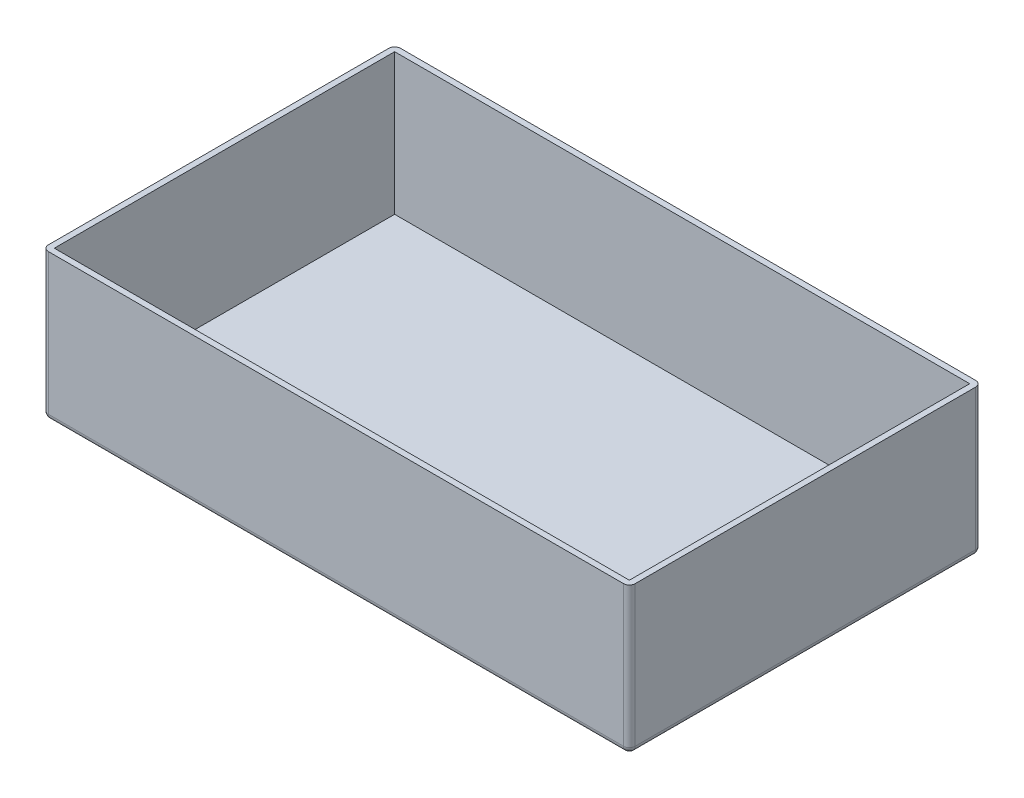
ISO-10303-21;
HEADER;
FILE_DESCRIPTION(('STEP AP214'),'2;1');
FILE_NAME('part.step','',(''),(''),'','','');
FILE_SCHEMA(('AUTOMOTIVE_DESIGN { 1 0 10303 214 1 1 1 1 }'));
ENDSEC;
DATA;
#1=APPLICATION_CONTEXT('core data for automotive mechanical design processes');
#2=APPLICATION_PROTOCOL_DEFINITION('international standard','automotive_design',2000,#1);
#3=PRODUCT_CONTEXT('',#1,'mechanical');
#4=PRODUCT('Part','Part','',(#3));
#5=PRODUCT_RELATED_PRODUCT_CATEGORY('part','',(#4));
#6=PRODUCT_DEFINITION_FORMATION('','',#4);
#7=PRODUCT_DEFINITION_CONTEXT('part definition',#1,'design');
#8=PRODUCT_DEFINITION('design','',#6,#7);
#9=PRODUCT_DEFINITION_SHAPE('','',#8);
#10=(LENGTH_UNIT() NAMED_UNIT(*) SI_UNIT(.MILLI.,.METRE.));
#11=(NAMED_UNIT(*) PLANE_ANGLE_UNIT() SI_UNIT($,.RADIAN.));
#12=(NAMED_UNIT(*) SI_UNIT($,.STERADIAN.) SOLID_ANGLE_UNIT());
#13=UNCERTAINTY_MEASURE_WITH_UNIT(LENGTH_MEASURE(1.E-05),#10,'distance_accuracy_value','');
#14=(GEOMETRIC_REPRESENTATION_CONTEXT(3) GLOBAL_UNCERTAINTY_ASSIGNED_CONTEXT((#13)) GLOBAL_UNIT_ASSIGNED_CONTEXT((#10,
#11,#12)) REPRESENTATION_CONTEXT('',''));
#15=CARTESIAN_POINT('',(0.,0.,0.));
#16=DIRECTION('',(0.,0.,1.));
#17=DIRECTION('',(1.,0.,0.));
#18=AXIS2_PLACEMENT_3D('',#15,#16,#17);
#19=CARTESIAN_POINT('',(100.,50.,-60.));
#20=DIRECTION('',(-1.,0.,0.));
#21=DIRECTION('',(0.,0.,1.));
#22=AXIS2_PLACEMENT_3D('',#19,#20,#21);
#23=PLANE('',#22);
#24=DIRECTION('',(0.,0.,-1.));
#25=VECTOR('',#24,1.);
#26=CARTESIAN_POINT('',(100.,50.,-60.));
#27=LINE('',#26,#25);
#28=CARTESIAN_POINT('',(100.,50.,58.));
#29=VERTEX_POINT('',#28);
#30=CARTESIAN_POINT('',(100.,50.,-58.));
#31=VERTEX_POINT('',#30);
#32=EDGE_CURVE('E188',#29,#31,#27,.T.);
#33=ORIENTED_EDGE('',*,*,#32,.F.);
#34=DIRECTION('',(0.,-1.,0.));
#35=VECTOR('',#34,1.);
#36=CARTESIAN_POINT('',(100.,50.,58.));
#37=LINE('',#36,#35);
#38=CARTESIAN_POINT('',(100.,2.,58.));
#39=VERTEX_POINT('',#38);
#40=EDGE_CURVE('E57',#29,#39,#37,.T.);
#41=ORIENTED_EDGE('',*,*,#40,.T.);
#42=DIRECTION('',(0.,0.,-1.));
#43=VECTOR('',#42,1.);
#44=CARTESIAN_POINT('',(100.,2.,-60.));
#45=LINE('',#44,#43);
#46=CARTESIAN_POINT('',(100.,2.,-58.));
#47=VERTEX_POINT('',#46);
#48=EDGE_CURVE('E62',#39,#47,#45,.T.);
#49=ORIENTED_EDGE('',*,*,#48,.T.);
#50=DIRECTION('',(0.,-1.,0.));
#51=VECTOR('',#50,1.);
#52=CARTESIAN_POINT('',(100.,50.,-58.));
#53=LINE('',#52,#51);
#54=EDGE_CURVE('E245',#47,#31,#53,.F.);
#55=ORIENTED_EDGE('',*,*,#54,.T.);
#56=EDGE_LOOP('',(#33,#41,#49,#55));
#57=FACE_BOUND('',#56,.T.);
#58=ADVANCED_FACE('F39',(#57),#23,.F.);
#59=CARTESIAN_POINT('',(-100.,50.,-60.));
#60=DIRECTION('',(0.,0.,1.));
#61=DIRECTION('',(1.,0.,0.));
#62=AXIS2_PLACEMENT_3D('',#59,#60,#61);
#63=PLANE('',#62);
#64=DIRECTION('',(-1.,0.,0.));
#65=VECTOR('',#64,1.);
#66=CARTESIAN_POINT('',(-100.,2.,-60.));
#67=LINE('',#66,#65);
#68=CARTESIAN_POINT('',(98.,2.,-60.));
#69=VERTEX_POINT('',#68);
#70=CARTESIAN_POINT('',(-98.,2.,-60.));
#71=VERTEX_POINT('',#70);
#72=EDGE_CURVE('E207',#69,#71,#67,.T.);
#73=ORIENTED_EDGE('',*,*,#72,.T.);
#74=DIRECTION('',(0.,-1.,0.));
#75=VECTOR('',#74,1.);
#76=CARTESIAN_POINT('',(-98.,50.,-60.));
#77=LINE('',#76,#75);
#78=CARTESIAN_POINT('',(-98.,50.,-60.));
#79=VERTEX_POINT('',#78);
#80=EDGE_CURVE('E211',#71,#79,#77,.F.);
#81=ORIENTED_EDGE('',*,*,#80,.T.);
#82=DIRECTION('',(-1.,0.,0.));
#83=VECTOR('',#82,1.);
#84=CARTESIAN_POINT('',(-100.,50.,-60.));
#85=LINE('',#84,#83);
#86=CARTESIAN_POINT('',(98.,50.,-60.));
#87=VERTEX_POINT('',#86);
#88=EDGE_CURVE('E192',#87,#79,#85,.T.);
#89=ORIENTED_EDGE('',*,*,#88,.F.);
#90=DIRECTION('',(0.,-1.,0.));
#91=VECTOR('',#90,1.);
#92=CARTESIAN_POINT('',(98.,50.,-60.));
#93=LINE('',#92,#91);
#94=EDGE_CURVE('E204',#87,#69,#93,.T.);
#95=ORIENTED_EDGE('',*,*,#94,.T.);
#96=EDGE_LOOP('',(#73,#81,#89,#95));
#97=FACE_BOUND('',#96,.T.);
#98=ADVANCED_FACE('F350',(#97),#63,.F.);
#99=CARTESIAN_POINT('',(-100.,50.,-60.));
#100=DIRECTION('',(1.,0.,0.));
#101=DIRECTION('',(0.,0.,-1.));
#102=AXIS2_PLACEMENT_3D('',#99,#100,#101);
#103=PLANE('',#102);
#104=DIRECTION('',(0.,0.,1.));
#105=VECTOR('',#104,1.);
#106=CARTESIAN_POINT('',(-100.,2.,-60.));
#107=LINE('',#106,#105);
#108=CARTESIAN_POINT('',(-100.,2.,-58.));
#109=VERTEX_POINT('',#108);
#110=CARTESIAN_POINT('',(-100.,2.,58.));
#111=VERTEX_POINT('',#110);
#112=EDGE_CURVE('E230',#109,#111,#107,.T.);
#113=ORIENTED_EDGE('',*,*,#112,.T.);
#114=DIRECTION('',(0.,-1.,0.));
#115=VECTOR('',#114,1.);
#116=CARTESIAN_POINT('',(-100.,50.,58.));
#117=LINE('',#116,#115);
#118=CARTESIAN_POINT('',(-100.,50.,58.));
#119=VERTEX_POINT('',#118);
#120=EDGE_CURVE('E233',#111,#119,#117,.F.);
#121=ORIENTED_EDGE('',*,*,#120,.T.);
#122=DIRECTION('',(0.,0.,1.));
#123=VECTOR('',#122,1.);
#124=CARTESIAN_POINT('',(-100.,50.,-60.));
#125=LINE('',#124,#123);
#126=CARTESIAN_POINT('',(-100.,50.,-58.));
#127=VERTEX_POINT('',#126);
#128=EDGE_CURVE('E196',#127,#119,#125,.T.);
#129=ORIENTED_EDGE('',*,*,#128,.F.);
#130=DIRECTION('',(0.,-1.,0.));
#131=VECTOR('',#130,1.);
#132=CARTESIAN_POINT('',(-100.,50.,-58.));
#133=LINE('',#132,#131);
#134=EDGE_CURVE('E227',#127,#109,#133,.T.);
#135=ORIENTED_EDGE('',*,*,#134,.T.);
#136=EDGE_LOOP('',(#113,#121,#129,#135));
#137=FACE_BOUND('',#136,.T.);
#138=ADVANCED_FACE('F358',(#137),#103,.F.);
#139=CARTESIAN_POINT('',(-100.,50.,60.));
#140=DIRECTION('',(0.,0.,-1.));
#141=DIRECTION('',(-1.,0.,0.));
#142=AXIS2_PLACEMENT_3D('',#139,#140,#141);
#143=PLANE('',#142);
#144=DIRECTION('',(1.,0.,0.));
#145=VECTOR('',#144,1.);
#146=CARTESIAN_POINT('',(-100.,2.,60.));
#147=LINE('',#146,#145);
#148=CARTESIAN_POINT('',(-98.,2.,60.));
#149=VERTEX_POINT('',#148);
#150=CARTESIAN_POINT('',(98.,2.,60.));
#151=VERTEX_POINT('',#150);
#152=EDGE_CURVE('E239',#149,#151,#147,.T.);
#153=ORIENTED_EDGE('',*,*,#152,.T.);
#154=DIRECTION('',(0.,-1.,0.));
#155=VECTOR('',#154,1.);
#156=CARTESIAN_POINT('',(98.,50.,60.));
#157=LINE('',#156,#155);
#158=CARTESIAN_POINT('',(98.,50.,60.));
#159=VERTEX_POINT('',#158);
#160=EDGE_CURVE('E242',#151,#159,#157,.F.);
#161=ORIENTED_EDGE('',*,*,#160,.T.);
#162=DIRECTION('',(1.,0.,0.));
#163=VECTOR('',#162,1.);
#164=CARTESIAN_POINT('',(-100.,50.,60.));
#165=LINE('',#164,#163);
#166=CARTESIAN_POINT('',(-98.,50.,60.));
#167=VERTEX_POINT('',#166);
#168=EDGE_CURVE('E200',#167,#159,#165,.T.);
#169=ORIENTED_EDGE('',*,*,#168,.F.);
#170=DIRECTION('',(0.,-1.,0.));
#171=VECTOR('',#170,1.);
#172=CARTESIAN_POINT('',(-98.,50.,60.));
#173=LINE('',#172,#171);
#174=EDGE_CURVE('E236',#167,#149,#173,.T.);
#175=ORIENTED_EDGE('',*,*,#174,.T.);
#176=EDGE_LOOP('',(#153,#161,#169,#175));
#177=FACE_BOUND('',#176,.T.);
#178=ADVANCED_FACE('F324',(#177),#143,.F.);
#179=CARTESIAN_POINT('',(0.,50.,0.));
#180=DIRECTION('',(0.,1.,0.));
#181=DIRECTION('',(0.,0.,1.));
#182=AXIS2_PLACEMENT_3D('',#179,#180,#181);
#183=PLANE('',#182);
#184=DIRECTION('',(0.,0.,-1.));
#185=VECTOR('',#184,1.);
#186=CARTESIAN_POINT('',(98.,50.,-60.));
#187=LINE('',#186,#185);
#188=CARTESIAN_POINT('',(98.,50.,58.));
#189=VERTEX_POINT('',#188);
#190=CARTESIAN_POINT('',(98.,50.,-58.));
#191=VERTEX_POINT('',#190);
#192=EDGE_CURVE('E172',#189,#191,#187,.T.);
#193=ORIENTED_EDGE('',*,*,#192,.F.);
#194=DIRECTION('',(1.,0.,0.));
#195=VECTOR('',#194,1.);
#196=CARTESIAN_POINT('',(-100.,50.,58.));
#197=LINE('',#196,#195);
#198=CARTESIAN_POINT('',(-98.,50.,58.));
#199=VERTEX_POINT('',#198);
#200=EDGE_CURVE('E185',#199,#189,#197,.T.);
#201=ORIENTED_EDGE('',*,*,#200,.F.);
#202=DIRECTION('',(0.,0.,1.));
#203=VECTOR('',#202,1.);
#204=CARTESIAN_POINT('',(-98.,50.,-60.));
#205=LINE('',#204,#203);
#206=CARTESIAN_POINT('',(-98.,50.,-58.));
#207=VERTEX_POINT('',#206);
#208=EDGE_CURVE('E182',#207,#199,#205,.T.);
#209=ORIENTED_EDGE('',*,*,#208,.F.);
#210=DIRECTION('',(-1.,0.,0.));
#211=VECTOR('',#210,1.);
#212=CARTESIAN_POINT('',(-100.,50.,-58.));
#213=LINE('',#212,#211);
#214=EDGE_CURVE('E158',#191,#207,#213,.T.);
#215=ORIENTED_EDGE('',*,*,#214,.F.);
#216=EDGE_LOOP('',(#193,#201,#209,#215));
#217=FACE_BOUND('',#216,.T.);
#218=ORIENTED_EDGE('',*,*,#168,.T.);
#219=CARTESIAN_POINT('',(98.,50.,58.));
#220=DIRECTION('',(0.,1.,0.));
#221=DIRECTION('',(0.,0.,1.));
#222=AXIS2_PLACEMENT_3D('',#219,#220,#221);
#223=CIRCLE('',#222,2.);
#224=EDGE_CURVE('E11',#159,#29,#223,.T.);
#225=ORIENTED_EDGE('',*,*,#224,.T.);
#226=ORIENTED_EDGE('',*,*,#32,.T.);
#227=CARTESIAN_POINT('',(98.,50.,-58.));
#228=DIRECTION('',(0.,1.,0.));
#229=DIRECTION('',(0.,0.,1.));
#230=AXIS2_PLACEMENT_3D('',#227,#228,#229);
#231=CIRCLE('',#230,2.);
#232=EDGE_CURVE('E252',#31,#87,#231,.T.);
#233=ORIENTED_EDGE('',*,*,#232,.T.);
#234=ORIENTED_EDGE('',*,*,#88,.T.);
#235=CARTESIAN_POINT('',(-98.,50.,-58.));
#236=DIRECTION('',(0.,1.,0.));
#237=DIRECTION('',(0.,0.,1.));
#238=AXIS2_PLACEMENT_3D('',#235,#236,#237);
#239=CIRCLE('',#238,2.);
#240=EDGE_CURVE('E255',#79,#127,#239,.T.);
#241=ORIENTED_EDGE('',*,*,#240,.T.);
#242=ORIENTED_EDGE('',*,*,#128,.T.);
#243=CARTESIAN_POINT('',(-98.,50.,58.));
#244=DIRECTION('',(0.,1.,0.));
#245=DIRECTION('',(0.,0.,1.));
#246=AXIS2_PLACEMENT_3D('',#243,#244,#245);
#247=CIRCLE('',#246,2.);
#248=EDGE_CURVE('E49',#119,#167,#247,.T.);
#249=ORIENTED_EDGE('',*,*,#248,.T.);
#250=EDGE_LOOP('',(#218,#225,#226,#233,#234,#241,#242,#249));
#251=FACE_BOUND('',#250,.T.);
#252=ADVANCED_FACE('F320',(#217,#251),#183,.T.);
#253=CARTESIAN_POINT('',(0.,0.,0.));
#254=DIRECTION('',(0.,1.,0.));
#255=DIRECTION('',(0.,0.,1.));
#256=AXIS2_PLACEMENT_3D('',#253,#254,#255);
#257=PLANE('',#256);
#258=DIRECTION('',(0.,0.,1.));
#259=VECTOR('',#258,1.);
#260=CARTESIAN_POINT('',(-98.,0.,0.));
#261=LINE('',#260,#259);
#262=CARTESIAN_POINT('',(-98.,0.,58.));
#263=VERTEX_POINT('',#262);
#264=CARTESIAN_POINT('',(-98.,0.,-58.));
#265=VERTEX_POINT('',#264);
#266=EDGE_CURVE('E220',#263,#265,#261,.F.);
#267=ORIENTED_EDGE('',*,*,#266,.T.);
#268=DIRECTION('',(-1.,0.,0.));
#269=VECTOR('',#268,1.);
#270=CARTESIAN_POINT('',(0.,0.,-58.));
#271=LINE('',#270,#269);
#272=CARTESIAN_POINT('',(98.,0.,-58.));
#273=VERTEX_POINT('',#272);
#274=EDGE_CURVE('E223',#265,#273,#271,.F.);
#275=ORIENTED_EDGE('',*,*,#274,.T.);
#276=DIRECTION('',(0.,0.,-1.));
#277=VECTOR('',#276,1.);
#278=CARTESIAN_POINT('',(98.,0.,0.));
#279=LINE('',#278,#277);
#280=CARTESIAN_POINT('',(98.,0.,58.));
#281=VERTEX_POINT('',#280);
#282=EDGE_CURVE('E214',#273,#281,#279,.F.);
#283=ORIENTED_EDGE('',*,*,#282,.T.);
#284=DIRECTION('',(1.,0.,0.));
#285=VECTOR('',#284,1.);
#286=CARTESIAN_POINT('',(0.,0.,58.));
#287=LINE('',#286,#285);
#288=EDGE_CURVE('E217',#281,#263,#287,.F.);
#289=ORIENTED_EDGE('',*,*,#288,.T.);
#290=EDGE_LOOP('',(#267,#275,#283,#289));
#291=FACE_BOUND('',#290,.T.);
#292=ADVANCED_FACE('F323',(#291),#257,.F.);
#293=CARTESIAN_POINT('',(98.,50.,-60.));
#294=DIRECTION('',(-1.,0.,0.));
#295=DIRECTION('',(0.,0.,1.));
#296=AXIS2_PLACEMENT_3D('',#293,#294,#295);
#297=PLANE('',#296);
#298=DIRECTION('',(0.,0.,-1.));
#299=VECTOR('',#298,1.);
#300=CARTESIAN_POINT('',(98.,2.,-60.));
#301=LINE('',#300,#299);
#302=CARTESIAN_POINT('',(98.,2.,58.));
#303=VERTEX_POINT('',#302);
#304=CARTESIAN_POINT('',(98.,2.,-58.));
#305=VERTEX_POINT('',#304);
#306=EDGE_CURVE('E148',#303,#305,#301,.T.);
#307=ORIENTED_EDGE('',*,*,#306,.F.);
#308=DIRECTION('',(0.,-1.,0.));
#309=VECTOR('',#308,1.);
#310=CARTESIAN_POINT('',(98.,50.,58.));
#311=LINE('',#310,#309);
#312=EDGE_CURVE('E176',#189,#303,#311,.T.);
#313=ORIENTED_EDGE('',*,*,#312,.F.);
#314=ORIENTED_EDGE('',*,*,#192,.T.);
#315=DIRECTION('',(0.,-1.,0.));
#316=VECTOR('',#315,1.);
#317=CARTESIAN_POINT('',(98.,50.,-58.));
#318=LINE('',#317,#316);
#319=EDGE_CURVE('E163',#191,#305,#318,.T.);
#320=ORIENTED_EDGE('',*,*,#319,.T.);
#321=EDGE_LOOP('',(#307,#313,#314,#320));
#322=FACE_BOUND('',#321,.T.);
#323=ADVANCED_FACE('F318',(#322),#297,.T.);
#324=CARTESIAN_POINT('',(-100.,50.,-58.));
#325=DIRECTION('',(0.,0.,1.));
#326=DIRECTION('',(1.,0.,0.));
#327=AXIS2_PLACEMENT_3D('',#324,#325,#326);
#328=PLANE('',#327);
#329=DIRECTION('',(-1.,0.,0.));
#330=VECTOR('',#329,1.);
#331=CARTESIAN_POINT('',(-100.,2.,-58.));
#332=LINE('',#331,#330);
#333=CARTESIAN_POINT('',(-98.,2.,-58.));
#334=VERTEX_POINT('',#333);
#335=EDGE_CURVE('E141',#305,#334,#332,.T.);
#336=ORIENTED_EDGE('',*,*,#335,.F.);
#337=ORIENTED_EDGE('',*,*,#319,.F.);
#338=ORIENTED_EDGE('',*,*,#214,.T.);
#339=DIRECTION('',(0.,-1.,0.));
#340=VECTOR('',#339,1.);
#341=CARTESIAN_POINT('',(-98.,50.,-58.));
#342=LINE('',#341,#340);
#343=EDGE_CURVE('E155',#207,#334,#342,.T.);
#344=ORIENTED_EDGE('',*,*,#343,.T.);
#345=EDGE_LOOP('',(#336,#337,#338,#344));
#346=FACE_BOUND('',#345,.T.);
#347=ADVANCED_FACE('F156',(#346),#328,.T.);
#348=CARTESIAN_POINT('',(-98.,50.,-60.));
#349=DIRECTION('',(1.,0.,0.));
#350=DIRECTION('',(0.,0.,-1.));
#351=AXIS2_PLACEMENT_3D('',#348,#349,#350);
#352=PLANE('',#351);
#353=DIRECTION('',(0.,0.,1.));
#354=VECTOR('',#353,1.);
#355=CARTESIAN_POINT('',(-98.,2.,-60.));
#356=LINE('',#355,#354);
#357=CARTESIAN_POINT('',(-98.,2.,58.));
#358=VERTEX_POINT('',#357);
#359=EDGE_CURVE('E145',#334,#358,#356,.T.);
#360=ORIENTED_EDGE('',*,*,#359,.F.);
#361=ORIENTED_EDGE('',*,*,#343,.F.);
#362=ORIENTED_EDGE('',*,*,#208,.T.);
#363=DIRECTION('',(0.,-1.,0.));
#364=VECTOR('',#363,1.);
#365=CARTESIAN_POINT('',(-98.,50.,58.));
#366=LINE('',#365,#364);
#367=EDGE_CURVE('E164',#199,#358,#366,.T.);
#368=ORIENTED_EDGE('',*,*,#367,.T.);
#369=EDGE_LOOP('',(#360,#361,#362,#368));
#370=FACE_BOUND('',#369,.T.);
#371=ADVANCED_FACE('F166',(#370),#352,.T.);
#372=CARTESIAN_POINT('',(-100.,50.,58.));
#373=DIRECTION('',(0.,0.,-1.));
#374=DIRECTION('',(-1.,0.,0.));
#375=AXIS2_PLACEMENT_3D('',#372,#373,#374);
#376=PLANE('',#375);
#377=DIRECTION('',(1.,0.,0.));
#378=VECTOR('',#377,1.);
#379=CARTESIAN_POINT('',(-100.,2.,58.));
#380=LINE('',#379,#378);
#381=EDGE_CURVE('E169',#358,#303,#380,.T.);
#382=ORIENTED_EDGE('',*,*,#381,.F.);
#383=ORIENTED_EDGE('',*,*,#367,.F.);
#384=ORIENTED_EDGE('',*,*,#200,.T.);
#385=ORIENTED_EDGE('',*,*,#312,.T.);
#386=EDGE_LOOP('',(#382,#383,#384,#385));
#387=FACE_BOUND('',#386,.T.);
#388=ADVANCED_FACE('F314',(#387),#376,.T.);
#389=CARTESIAN_POINT('',(0.,2.,0.));
#390=DIRECTION('',(0.,1.,0.));
#391=DIRECTION('',(0.,0.,1.));
#392=AXIS2_PLACEMENT_3D('',#389,#390,#391);
#393=PLANE('',#392);
#394=ORIENTED_EDGE('',*,*,#306,.T.);
#395=ORIENTED_EDGE('',*,*,#335,.T.);
#396=ORIENTED_EDGE('',*,*,#359,.T.);
#397=ORIENTED_EDGE('',*,*,#381,.T.);
#398=EDGE_LOOP('',(#394,#395,#396,#397));
#399=FACE_BOUND('',#398,.T.);
#400=ADVANCED_FACE('F143',(#399),#393,.T.);
#401=CARTESIAN_POINT('',(98.,50.,58.));
#402=DIRECTION('',(0.,-1.,0.));
#403=DIRECTION('',(0.,0.,-1.));
#404=AXIS2_PLACEMENT_3D('',#401,#402,#403);
#405=CYLINDRICAL_SURFACE('',#404,2.);
#406=ORIENTED_EDGE('',*,*,#224,.F.);
#407=ORIENTED_EDGE('',*,*,#160,.F.);
#408=CARTESIAN_POINT('',(98.,2.,58.));
#409=DIRECTION('',(0.,-1.,0.));
#410=DIRECTION('',(0.,0.,-1.));
#411=AXIS2_PLACEMENT_3D('',#408,#409,#410);
#412=CIRCLE('',#411,2.);
#413=EDGE_CURVE('E297',#39,#151,#412,.T.);
#414=ORIENTED_EDGE('',*,*,#413,.F.);
#415=ORIENTED_EDGE('',*,*,#40,.F.);
#416=EDGE_LOOP('',(#406,#407,#414,#415));
#417=FACE_BOUND('',#416,.T.);
#418=ADVANCED_FACE('F41',(#417),#405,.T.);
#419=CARTESIAN_POINT('',(-98.,50.,58.));
#420=DIRECTION('',(0.,-1.,0.));
#421=DIRECTION('',(0.,0.,-1.));
#422=AXIS2_PLACEMENT_3D('',#419,#420,#421);
#423=CYLINDRICAL_SURFACE('',#422,2.);
#424=ORIENTED_EDGE('',*,*,#248,.F.);
#425=ORIENTED_EDGE('',*,*,#120,.F.);
#426=CARTESIAN_POINT('',(-98.,2.,58.));
#427=DIRECTION('',(0.,-1.,0.));
#428=DIRECTION('',(0.,0.,-1.));
#429=AXIS2_PLACEMENT_3D('',#426,#427,#428);
#430=CIRCLE('',#429,2.);
#431=EDGE_CURVE('E294',#149,#111,#430,.T.);
#432=ORIENTED_EDGE('',*,*,#431,.F.);
#433=ORIENTED_EDGE('',*,*,#174,.F.);
#434=EDGE_LOOP('',(#424,#425,#432,#433));
#435=FACE_BOUND('',#434,.T.);
#436=ADVANCED_FACE('F363',(#435),#423,.T.);
#437=CARTESIAN_POINT('',(-100.,2.,58.));
#438=DIRECTION('',(1.,0.,0.));
#439=DIRECTION('',(0.,0.,-1.));
#440=AXIS2_PLACEMENT_3D('',#437,#438,#439);
#441=CYLINDRICAL_SURFACE('',#440,2.);
#442=CARTESIAN_POINT('',(98.,2.,58.));
#443=DIRECTION('',(1.,0.,0.));
#444=DIRECTION('',(0.,0.,-1.));
#445=AXIS2_PLACEMENT_3D('',#442,#443,#444);
#446=CIRCLE('',#445,2.);
#447=EDGE_CURVE('E43',#151,#281,#446,.T.);
#448=ORIENTED_EDGE('',*,*,#447,.F.);
#449=ORIENTED_EDGE('',*,*,#152,.F.);
#450=CARTESIAN_POINT('',(-98.,2.,58.));
#451=DIRECTION('',(-1.,0.,0.));
#452=DIRECTION('',(0.,0.,1.));
#453=AXIS2_PLACEMENT_3D('',#450,#451,#452);
#454=CIRCLE('',#453,2.);
#455=EDGE_CURVE('E290',#263,#149,#454,.T.);
#456=ORIENTED_EDGE('',*,*,#455,.F.);
#457=ORIENTED_EDGE('',*,*,#288,.F.);
#458=EDGE_LOOP('',(#448,#449,#456,#457));
#459=FACE_BOUND('',#458,.T.);
#460=ADVANCED_FACE('F377',(#459),#441,.T.);
#461=CARTESIAN_POINT('',(98.,2.,58.));
#462=DIRECTION('',(0.,0.,1.));
#463=DIRECTION('',(1.,0.,0.));
#464=AXIS2_PLACEMENT_3D('',#461,#462,#463);
#465=SPHERICAL_SURFACE('',#464,2.);
#466=ORIENTED_EDGE('',*,*,#413,.T.);
#467=ORIENTED_EDGE('',*,*,#447,.T.);
#468=CARTESIAN_POINT('',(98.,2.,58.));
#469=DIRECTION('',(0.,0.,1.));
#470=DIRECTION('',(1.,0.,0.));
#471=AXIS2_PLACEMENT_3D('',#468,#469,#470);
#472=CIRCLE('',#471,2.);
#473=EDGE_CURVE('E286',#39,#281,#472,.F.);
#474=ORIENTED_EDGE('',*,*,#473,.F.);
#475=EDGE_LOOP('',(#466,#467,#474));
#476=FACE_BOUND('',#475,.T.);
#477=ADVANCED_FACE('F333',(#476),#465,.T.);
#478=CARTESIAN_POINT('',(-98.,2.,58.));
#479=DIRECTION('',(0.,0.,1.));
#480=DIRECTION('',(1.,0.,0.));
#481=AXIS2_PLACEMENT_3D('',#478,#479,#480);
#482=SPHERICAL_SURFACE('',#481,2.);
#483=ORIENTED_EDGE('',*,*,#455,.T.);
#484=ORIENTED_EDGE('',*,*,#431,.T.);
#485=CARTESIAN_POINT('',(-98.,2.,58.));
#486=DIRECTION('',(0.,0.,1.));
#487=DIRECTION('',(1.,0.,0.));
#488=AXIS2_PLACEMENT_3D('',#485,#486,#487);
#489=CIRCLE('',#488,2.);
#490=EDGE_CURVE('E282',#263,#111,#489,.F.);
#491=ORIENTED_EDGE('',*,*,#490,.F.);
#492=EDGE_LOOP('',(#483,#484,#491));
#493=FACE_BOUND('',#492,.T.);
#494=ADVANCED_FACE('F366',(#493),#482,.T.);
#495=CARTESIAN_POINT('',(98.,2.,-60.));
#496=DIRECTION('',(0.,0.,-1.));
#497=DIRECTION('',(-1.,0.,0.));
#498=AXIS2_PLACEMENT_3D('',#495,#496,#497);
#499=CYLINDRICAL_SURFACE('',#498,2.);
#500=ORIENTED_EDGE('',*,*,#473,.T.);
#501=ORIENTED_EDGE('',*,*,#282,.F.);
#502=CARTESIAN_POINT('',(98.,2.,-58.));
#503=DIRECTION('',(0.,0.,-1.));
#504=DIRECTION('',(-1.,0.,0.));
#505=AXIS2_PLACEMENT_3D('',#502,#503,#504);
#506=CIRCLE('',#505,2.);
#507=EDGE_CURVE('E278',#47,#273,#506,.T.);
#508=ORIENTED_EDGE('',*,*,#507,.F.);
#509=ORIENTED_EDGE('',*,*,#48,.F.);
#510=EDGE_LOOP('',(#500,#501,#508,#509));
#511=FACE_BOUND('',#510,.T.);
#512=ADVANCED_FACE('F337',(#511),#499,.T.);
#513=CARTESIAN_POINT('',(98.,50.,-58.));
#514=DIRECTION('',(0.,-1.,0.));
#515=DIRECTION('',(0.,0.,-1.));
#516=AXIS2_PLACEMENT_3D('',#513,#514,#515);
#517=CYLINDRICAL_SURFACE('',#516,2.);
#518=ORIENTED_EDGE('',*,*,#232,.F.);
#519=ORIENTED_EDGE('',*,*,#54,.F.);
#520=CARTESIAN_POINT('',(98.,2.,-58.));
#521=DIRECTION('',(0.,-1.,0.));
#522=DIRECTION('',(0.,0.,-1.));
#523=AXIS2_PLACEMENT_3D('',#520,#521,#522);
#524=CIRCLE('',#523,2.);
#525=EDGE_CURVE('E274',#69,#47,#524,.T.);
#526=ORIENTED_EDGE('',*,*,#525,.F.);
#527=ORIENTED_EDGE('',*,*,#94,.F.);
#528=EDGE_LOOP('',(#518,#519,#526,#527));
#529=FACE_BOUND('',#528,.T.);
#530=ADVANCED_FACE('F346',(#529),#517,.T.);
#531=CARTESIAN_POINT('',(-98.,50.,-58.));
#532=DIRECTION('',(0.,-1.,0.));
#533=DIRECTION('',(0.,0.,-1.));
#534=AXIS2_PLACEMENT_3D('',#531,#532,#533);
#535=CYLINDRICAL_SURFACE('',#534,2.);
#536=ORIENTED_EDGE('',*,*,#240,.F.);
#537=ORIENTED_EDGE('',*,*,#80,.F.);
#538=CARTESIAN_POINT('',(-98.,2.,-58.));
#539=DIRECTION('',(0.,-1.,0.));
#540=DIRECTION('',(0.,0.,-1.));
#541=AXIS2_PLACEMENT_3D('',#538,#539,#540);
#542=CIRCLE('',#541,2.);
#543=EDGE_CURVE('E270',#109,#71,#542,.T.);
#544=ORIENTED_EDGE('',*,*,#543,.F.);
#545=ORIENTED_EDGE('',*,*,#134,.F.);
#546=EDGE_LOOP('',(#536,#537,#544,#545));
#547=FACE_BOUND('',#546,.T.);
#548=ADVANCED_FACE('F354',(#547),#535,.T.);
#549=CARTESIAN_POINT('',(-98.,2.,-60.));
#550=DIRECTION('',(0.,0.,1.));
#551=DIRECTION('',(1.,0.,0.));
#552=AXIS2_PLACEMENT_3D('',#549,#550,#551);
#553=CYLINDRICAL_SURFACE('',#552,2.);
#554=ORIENTED_EDGE('',*,*,#490,.T.);
#555=ORIENTED_EDGE('',*,*,#112,.F.);
#556=CARTESIAN_POINT('',(-98.,2.,-58.));
#557=DIRECTION('',(0.,0.,-1.));
#558=DIRECTION('',(-1.,0.,0.));
#559=AXIS2_PLACEMENT_3D('',#556,#557,#558);
#560=CIRCLE('',#559,2.);
#561=EDGE_CURVE('E266',#265,#109,#560,.T.);
#562=ORIENTED_EDGE('',*,*,#561,.F.);
#563=ORIENTED_EDGE('',*,*,#266,.F.);
#564=EDGE_LOOP('',(#554,#555,#562,#563));
#565=FACE_BOUND('',#564,.T.);
#566=ADVANCED_FACE('F370',(#565),#553,.T.);
#567=CARTESIAN_POINT('',(98.,2.,-58.));
#568=DIRECTION('',(0.,0.,1.));
#569=DIRECTION('',(1.,0.,0.));
#570=AXIS2_PLACEMENT_3D('',#567,#568,#569);
#571=SPHERICAL_SURFACE('',#570,2.);
#572=ORIENTED_EDGE('',*,*,#525,.T.);
#573=ORIENTED_EDGE('',*,*,#507,.T.);
#574=CARTESIAN_POINT('',(98.,2.,-58.));
#575=DIRECTION('',(1.,0.,0.));
#576=DIRECTION('',(0.,0.,-1.));
#577=AXIS2_PLACEMENT_3D('',#574,#575,#576);
#578=CIRCLE('',#577,2.);
#579=EDGE_CURVE('E263',#69,#273,#578,.F.);
#580=ORIENTED_EDGE('',*,*,#579,.F.);
#581=EDGE_LOOP('',(#572,#573,#580));
#582=FACE_BOUND('',#581,.T.);
#583=ADVANCED_FACE('F341',(#582),#571,.T.);
#584=CARTESIAN_POINT('',(-98.,2.,-58.));
#585=DIRECTION('',(0.,0.,1.));
#586=DIRECTION('',(1.,0.,0.));
#587=AXIS2_PLACEMENT_3D('',#584,#585,#586);
#588=SPHERICAL_SURFACE('',#587,2.);
#589=ORIENTED_EDGE('',*,*,#561,.T.);
#590=ORIENTED_EDGE('',*,*,#543,.T.);
#591=CARTESIAN_POINT('',(-98.,2.,-58.));
#592=DIRECTION('',(-1.,0.,0.));
#593=DIRECTION('',(0.,0.,1.));
#594=AXIS2_PLACEMENT_3D('',#591,#592,#593);
#595=CIRCLE('',#594,2.);
#596=EDGE_CURVE('E260',#265,#71,#595,.F.);
#597=ORIENTED_EDGE('',*,*,#596,.F.);
#598=EDGE_LOOP('',(#589,#590,#597));
#599=FACE_BOUND('',#598,.T.);
#600=ADVANCED_FACE('F395',(#599),#588,.T.);
#601=CARTESIAN_POINT('',(-100.,2.,-58.));
#602=DIRECTION('',(-1.,0.,0.));
#603=DIRECTION('',(0.,0.,1.));
#604=AXIS2_PLACEMENT_3D('',#601,#602,#603);
#605=CYLINDRICAL_SURFACE('',#604,2.);
#606=ORIENTED_EDGE('',*,*,#579,.T.);
#607=ORIENTED_EDGE('',*,*,#274,.F.);
#608=ORIENTED_EDGE('',*,*,#596,.T.);
#609=ORIENTED_EDGE('',*,*,#72,.F.);
#610=EDGE_LOOP('',(#606,#607,#608,#609));
#611=FACE_BOUND('',#610,.T.);
#612=ADVANCED_FACE('F392',(#611),#605,.T.);
#613=CLOSED_SHELL('',(#58,#98,#138,#178,#252,#292,#323,#347,#371,#388,#400,#418,#436,#460,#477,
#494,#512,#530,#548,#566,#583,#600,#612));
#614=MANIFOLD_SOLID_BREP('B2',#613);
#615=ADVANCED_BREP_SHAPE_REPRESENTATION('',(#18,#614),#14);
#616=SHAPE_DEFINITION_REPRESENTATION(#9,#615);
ENDSEC;
END-ISO-10303-21;
